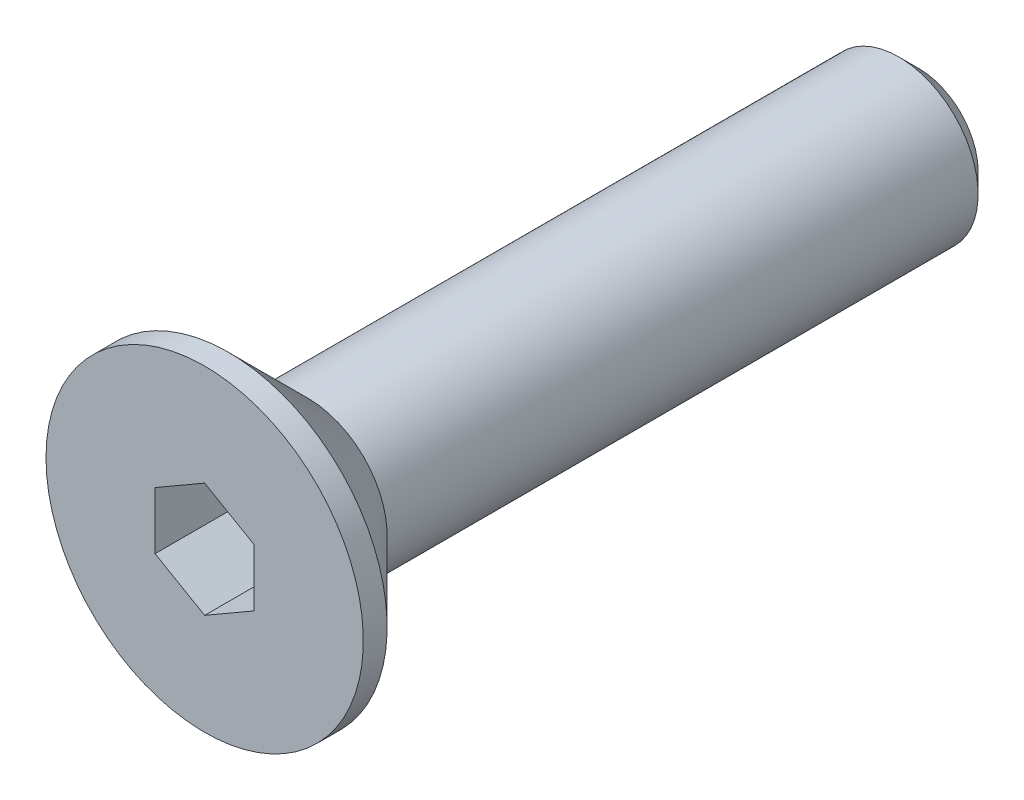
ISO-10303-21;
HEADER;
FILE_DESCRIPTION(('STEP AP214'),'2;1');
FILE_NAME('part.step','',(''),(''),'','','');
FILE_SCHEMA(('AUTOMOTIVE_DESIGN { 1 0 10303 214 1 1 1 1 }'));
ENDSEC;
DATA;
#1=APPLICATION_CONTEXT('core data for automotive mechanical design processes');
#2=APPLICATION_PROTOCOL_DEFINITION('international standard','automotive_design',2000,#1);
#3=PRODUCT_CONTEXT('',#1,'mechanical');
#4=PRODUCT('Part','Part','',(#3));
#5=PRODUCT_RELATED_PRODUCT_CATEGORY('part','',(#4));
#6=PRODUCT_DEFINITION_FORMATION('','',#4);
#7=PRODUCT_DEFINITION_CONTEXT('part definition',#1,'design');
#8=PRODUCT_DEFINITION('design','',#6,#7);
#9=PRODUCT_DEFINITION_SHAPE('','',#8);
#10=(LENGTH_UNIT() NAMED_UNIT(*) SI_UNIT(.MILLI.,.METRE.));
#11=(NAMED_UNIT(*) PLANE_ANGLE_UNIT() SI_UNIT($,.RADIAN.));
#12=(NAMED_UNIT(*) SI_UNIT($,.STERADIAN.) SOLID_ANGLE_UNIT());
#13=UNCERTAINTY_MEASURE_WITH_UNIT(LENGTH_MEASURE(1.E-05),#10,'distance_accuracy_value','');
#14=(GEOMETRIC_REPRESENTATION_CONTEXT(3) GLOBAL_UNCERTAINTY_ASSIGNED_CONTEXT((#13)) GLOBAL_UNIT_ASSIGNED_CONTEXT((#10,
#11,#12)) REPRESENTATION_CONTEXT('',''));
#15=CARTESIAN_POINT('',(0.,0.,0.));
#16=DIRECTION('',(0.,0.,1.));
#17=DIRECTION('',(1.,0.,0.));
#18=AXIS2_PLACEMENT_3D('',#15,#16,#17);
#19=CARTESIAN_POINT('',(0.,0.,9.));
#20=DIRECTION('',(0.,0.,1.));
#21=DIRECTION('',(1.,0.,0.));
#22=AXIS2_PLACEMENT_3D('',#19,#20,#21);
#23=PLANE('',#22);
#24=DIRECTION('',(-0.866025403784439,0.5,0.));
#25=VECTOR('',#24,1.);
#26=CARTESIAN_POINT('',(1.25,0.721687836487034,9.));
#27=LINE('',#26,#25);
#28=CARTESIAN_POINT('',(1.25,0.721687836487034,9.));
#29=VERTEX_POINT('',#28);
#30=CARTESIAN_POINT('',(0.,1.44337567297407,9.));
#31=VERTEX_POINT('',#30);
#32=EDGE_CURVE('E53',#29,#31,#27,.T.);
#33=ORIENTED_EDGE('',*,*,#32,.F.);
#34=DIRECTION('',(0.,1.,0.));
#35=VECTOR('',#34,1.);
#36=CARTESIAN_POINT('',(1.25,-0.721687836487031,9.));
#37=LINE('',#36,#35);
#38=CARTESIAN_POINT('',(1.25,-0.721687836487031,9.));
#39=VERTEX_POINT('',#38);
#40=EDGE_CURVE('E136',#39,#29,#37,.T.);
#41=ORIENTED_EDGE('',*,*,#40,.F.);
#42=DIRECTION('',(0.866025403784439,0.5,0.));
#43=VECTOR('',#42,1.);
#44=CARTESIAN_POINT('',(0.,-1.44337567297406,9.));
#45=LINE('',#44,#43);
#46=CARTESIAN_POINT('',(0.,-1.44337567297406,9.));
#47=VERTEX_POINT('',#46);
#48=EDGE_CURVE('E134',#47,#39,#45,.T.);
#49=ORIENTED_EDGE('',*,*,#48,.F.);
#50=DIRECTION('',(0.866025403784439,-0.5,0.));
#51=VECTOR('',#50,1.);
#52=CARTESIAN_POINT('',(-1.25,-0.721687836487031,9.));
#53=LINE('',#52,#51);
#54=CARTESIAN_POINT('',(-1.25,-0.721687836487031,9.));
#55=VERTEX_POINT('',#54);
#56=EDGE_CURVE('E101',#55,#47,#53,.T.);
#57=ORIENTED_EDGE('',*,*,#56,.F.);
#58=DIRECTION('',(0.,-1.,0.));
#59=VECTOR('',#58,1.);
#60=CARTESIAN_POINT('',(-1.25,0.721687836487034,9.));
#61=LINE('',#60,#59);
#62=CARTESIAN_POINT('',(-1.25,0.721687836487034,9.));
#63=VERTEX_POINT('',#62);
#64=EDGE_CURVE('E130',#63,#55,#61,.T.);
#65=ORIENTED_EDGE('',*,*,#64,.F.);
#66=DIRECTION('',(-0.866025403784439,-0.5,0.));
#67=VECTOR('',#66,1.);
#68=CARTESIAN_POINT('',(0.,1.44337567297407,9.));
#69=LINE('',#68,#67);
#70=EDGE_CURVE('E127',#31,#63,#69,.T.);
#71=ORIENTED_EDGE('',*,*,#70,.F.);
#72=EDGE_LOOP('',(#33,#41,#49,#57,#65,#71));
#73=FACE_BOUND('',#72,.T.);
#74=CARTESIAN_POINT('',(0.,0.,9.));
#75=DIRECTION('',(0.,0.,-1.));
#76=DIRECTION('',(-1.,0.,0.));
#77=AXIS2_PLACEMENT_3D('',#74,#75,#76);
#78=CIRCLE('',#77,4.);
#79=CARTESIAN_POINT('',(-4.,0.,9.));
#80=VERTEX_POINT('',#79);
#81=EDGE_CURVE('E151',#80,#80,#78,.T.);
#82=ORIENTED_EDGE('',*,*,#81,.F.);
#83=EDGE_LOOP('',(#82));
#84=FACE_BOUND('',#83,.T.);
#85=ADVANCED_FACE('F37',(#73,#84),#23,.T.);
#86=CARTESIAN_POINT('',(0.,0.,-9.));
#87=DIRECTION('',(0.,0.,-1.));
#88=DIRECTION('',(-1.,0.,0.));
#89=AXIS2_PLACEMENT_3D('',#86,#87,#88);
#90=CYLINDRICAL_SURFACE('',#89,4.);
#91=ORIENTED_EDGE('',*,*,#81,.T.);
#92=EDGE_LOOP('',(#91));
#93=FACE_BOUND('',#92,.T.);
#94=CARTESIAN_POINT('',(0.,0.,8.39999999999999));
#95=DIRECTION('',(0.,0.,-1.));
#96=DIRECTION('',(-1.,0.,0.));
#97=AXIS2_PLACEMENT_3D('',#94,#95,#96);
#98=CIRCLE('',#97,4.);
#99=CARTESIAN_POINT('',(-4.,0.,8.39999999999999));
#100=VERTEX_POINT('',#99);
#101=EDGE_CURVE('E148',#100,#100,#98,.T.);
#102=ORIENTED_EDGE('',*,*,#101,.F.);
#103=EDGE_LOOP('',(#102));
#104=FACE_BOUND('',#103,.T.);
#105=ADVANCED_FACE('F171',(#93,#104),#90,.T.);
#106=CARTESIAN_POINT('',(0.,0.,6.4));
#107=DIRECTION('',(0.,0.,1.));
#108=DIRECTION('',(1.,0.,0.));
#109=AXIS2_PLACEMENT_3D('',#106,#107,#108);
#110=CONICAL_SURFACE('',#109,2.,0.78539816339745);
#111=ORIENTED_EDGE('',*,*,#101,.T.);
#112=EDGE_LOOP('',(#111));
#113=FACE_BOUND('',#112,.T.);
#114=CARTESIAN_POINT('',(0.,0.,6.4));
#115=DIRECTION('',(0.,0.,-1.));
#116=DIRECTION('',(-1.,0.,0.));
#117=AXIS2_PLACEMENT_3D('',#114,#115,#116);
#118=CIRCLE('',#117,2.);
#119=CARTESIAN_POINT('',(-2.,0.,6.4));
#120=VERTEX_POINT('',#119);
#121=EDGE_CURVE('E140',#120,#120,#118,.T.);
#122=ORIENTED_EDGE('',*,*,#121,.F.);
#123=EDGE_LOOP('',(#122));
#124=FACE_BOUND('',#123,.T.);
#125=ADVANCED_FACE('F176',(#113,#124),#110,.T.);
#126=CARTESIAN_POINT('',(0.,0.,-9.));
#127=DIRECTION('',(0.,0.,-1.));
#128=DIRECTION('',(-1.,0.,0.));
#129=AXIS2_PLACEMENT_3D('',#126,#127,#128);
#130=CYLINDRICAL_SURFACE('',#129,2.);
#131=CARTESIAN_POINT('',(0.,0.,-8.49999999999999));
#132=DIRECTION('',(0.,0.,-1.));
#133=DIRECTION('',(-1.,0.,0.));
#134=AXIS2_PLACEMENT_3D('',#131,#132,#133);
#135=CIRCLE('',#134,2.);
#136=CARTESIAN_POINT('',(-2.,0.,-8.49999999999999));
#137=VERTEX_POINT('',#136);
#138=EDGE_CURVE('E11',#137,#137,#135,.F.);
#139=ORIENTED_EDGE('',*,*,#138,.T.);
#140=EDGE_LOOP('',(#139));
#141=FACE_BOUND('',#140,.T.);
#142=ORIENTED_EDGE('',*,*,#121,.T.);
#143=EDGE_LOOP('',(#142));
#144=FACE_BOUND('',#143,.T.);
#145=ADVANCED_FACE('F167',(#141,#144),#130,.T.);
#146=CARTESIAN_POINT('',(0.,2.,-9.));
#147=DIRECTION('',(0.,0.,-1.));
#148=DIRECTION('',(-1.,0.,0.));
#149=AXIS2_PLACEMENT_3D('',#146,#147,#148);
#150=PLANE('',#149);
#151=CARTESIAN_POINT('',(0.,0.,-9.));
#152=DIRECTION('',(0.,0.,-1.));
#153=DIRECTION('',(-1.,0.,0.));
#154=AXIS2_PLACEMENT_3D('',#151,#152,#153);
#155=CIRCLE('',#154,1.5);
#156=CARTESIAN_POINT('',(-1.5,0.,-9.));
#157=VERTEX_POINT('',#156);
#158=EDGE_CURVE('E46',#157,#157,#155,.T.);
#159=ORIENTED_EDGE('',*,*,#158,.T.);
#160=EDGE_LOOP('',(#159));
#161=FACE_BOUND('',#160,.T.);
#162=ADVANCED_FACE('F156',(#161),#150,.T.);
#163=CARTESIAN_POINT('',(0.,0.,-9.));
#164=DIRECTION('',(0.,0.,1.));
#165=DIRECTION('',(1.,0.,0.));
#166=AXIS2_PLACEMENT_3D('',#163,#164,#165);
#167=CONICAL_SURFACE('',#166,1.5,0.785398163397447);
#168=ORIENTED_EDGE('',*,*,#138,.F.);
#169=EDGE_LOOP('',(#168));
#170=FACE_BOUND('',#169,.T.);
#171=ORIENTED_EDGE('',*,*,#158,.F.);
#172=EDGE_LOOP('',(#171));
#173=FACE_BOUND('',#172,.T.);
#174=ADVANCED_FACE('F40',(#170,#173),#167,.T.);
#175=CARTESIAN_POINT('',(1.25,0.721687836487034,6.5));
#176=DIRECTION('',(0.5,0.866025403784439,0.));
#177=DIRECTION('',(-0.866025403784439,0.5,0.));
#178=AXIS2_PLACEMENT_3D('',#175,#176,#177);
#179=PLANE('',#178);
#180=ORIENTED_EDGE('',*,*,#32,.T.);
#181=DIRECTION('',(0.,0.,1.));
#182=VECTOR('',#181,1.);
#183=CARTESIAN_POINT('',(0.,1.44337567297407,6.5));
#184=LINE('',#183,#182);
#185=CARTESIAN_POINT('',(0.,1.44337567297407,6.5));
#186=VERTEX_POINT('',#185);
#187=EDGE_CURVE('E83',#186,#31,#184,.T.);
#188=ORIENTED_EDGE('',*,*,#187,.F.);
#189=DIRECTION('',(-0.866025403784439,0.5,0.));
#190=VECTOR('',#189,1.);
#191=CARTESIAN_POINT('',(1.25,0.721687836487034,6.5));
#192=LINE('',#191,#190);
#193=CARTESIAN_POINT('',(1.25,0.721687836487034,6.5));
#194=VERTEX_POINT('',#193);
#195=EDGE_CURVE('E138',#194,#186,#192,.T.);
#196=ORIENTED_EDGE('',*,*,#195,.F.);
#197=DIRECTION('',(0.,0.,1.));
#198=VECTOR('',#197,1.);
#199=CARTESIAN_POINT('',(1.25,0.721687836487034,6.5));
#200=LINE('',#199,#198);
#201=EDGE_CURVE('E61',#194,#29,#200,.T.);
#202=ORIENTED_EDGE('',*,*,#201,.T.);
#203=EDGE_LOOP('',(#180,#188,#196,#202));
#204=FACE_BOUND('',#203,.T.);
#205=ADVANCED_FACE('F159',(#204),#179,.F.);
#206=CARTESIAN_POINT('',(1.25,-0.721687836487031,6.5));
#207=DIRECTION('',(1.,0.,0.));
#208=DIRECTION('',(0.,1.,0.));
#209=AXIS2_PLACEMENT_3D('',#206,#207,#208);
#210=PLANE('',#209);
#211=ORIENTED_EDGE('',*,*,#40,.T.);
#212=ORIENTED_EDGE('',*,*,#201,.F.);
#213=DIRECTION('',(0.,1.,0.));
#214=VECTOR('',#213,1.);
#215=CARTESIAN_POINT('',(1.25,-0.721687836487031,6.5));
#216=LINE('',#215,#214);
#217=CARTESIAN_POINT('',(1.25,-0.721687836487031,6.5));
#218=VERTEX_POINT('',#217);
#219=EDGE_CURVE('E113',#218,#194,#216,.T.);
#220=ORIENTED_EDGE('',*,*,#219,.F.);
#221=DIRECTION('',(0.,0.,1.));
#222=VECTOR('',#221,1.);
#223=CARTESIAN_POINT('',(1.25,-0.721687836487031,6.5));
#224=LINE('',#223,#222);
#225=EDGE_CURVE('E105',#218,#39,#224,.T.);
#226=ORIENTED_EDGE('',*,*,#225,.T.);
#227=EDGE_LOOP('',(#211,#212,#220,#226));
#228=FACE_BOUND('',#227,.T.);
#229=ADVANCED_FACE('F165',(#228),#210,.F.);
#230=CARTESIAN_POINT('',(0.,-1.44337567297406,6.5));
#231=DIRECTION('',(0.5,-0.866025403784439,0.));
#232=DIRECTION('',(0.866025403784439,0.5,0.));
#233=AXIS2_PLACEMENT_3D('',#230,#231,#232);
#234=PLANE('',#233);
#235=ORIENTED_EDGE('',*,*,#48,.T.);
#236=ORIENTED_EDGE('',*,*,#225,.F.);
#237=DIRECTION('',(0.866025403784439,0.5,0.));
#238=VECTOR('',#237,1.);
#239=CARTESIAN_POINT('',(0.,-1.44337567297406,6.5));
#240=LINE('',#239,#238);
#241=CARTESIAN_POINT('',(0.,-1.44337567297406,6.5));
#242=VERTEX_POINT('',#241);
#243=EDGE_CURVE('E109',#242,#218,#240,.T.);
#244=ORIENTED_EDGE('',*,*,#243,.F.);
#245=DIRECTION('',(0.,0.,1.));
#246=VECTOR('',#245,1.);
#247=CARTESIAN_POINT('',(0.,-1.44337567297406,6.5));
#248=LINE('',#247,#246);
#249=EDGE_CURVE('E94',#242,#47,#248,.T.);
#250=ORIENTED_EDGE('',*,*,#249,.T.);
#251=EDGE_LOOP('',(#235,#236,#244,#250));
#252=FACE_BOUND('',#251,.T.);
#253=ADVANCED_FACE('F110',(#252),#234,.F.);
#254=CARTESIAN_POINT('',(-1.25,-0.721687836487031,6.5));
#255=DIRECTION('',(-0.5,-0.866025403784438,0.));
#256=DIRECTION('',(0.866025403784439,-0.5,0.));
#257=AXIS2_PLACEMENT_3D('',#254,#255,#256);
#258=PLANE('',#257);
#259=ORIENTED_EDGE('',*,*,#56,.T.);
#260=ORIENTED_EDGE('',*,*,#249,.F.);
#261=DIRECTION('',(0.866025403784439,-0.5,0.));
#262=VECTOR('',#261,1.);
#263=CARTESIAN_POINT('',(-1.25,-0.721687836487031,6.5));
#264=LINE('',#263,#262);
#265=CARTESIAN_POINT('',(-1.25,-0.721687836487031,6.5));
#266=VERTEX_POINT('',#265);
#267=EDGE_CURVE('E98',#266,#242,#264,.T.);
#268=ORIENTED_EDGE('',*,*,#267,.F.);
#269=DIRECTION('',(0.,0.,1.));
#270=VECTOR('',#269,1.);
#271=CARTESIAN_POINT('',(-1.25,-0.721687836487031,6.5));
#272=LINE('',#271,#270);
#273=EDGE_CURVE('E106',#266,#55,#272,.T.);
#274=ORIENTED_EDGE('',*,*,#273,.T.);
#275=EDGE_LOOP('',(#259,#260,#268,#274));
#276=FACE_BOUND('',#275,.T.);
#277=ADVANCED_FACE('F96',(#276),#258,.F.);
#278=CARTESIAN_POINT('',(-1.25,0.721687836487034,6.5));
#279=DIRECTION('',(-1.,0.,0.));
#280=DIRECTION('',(0.,0.,1.));
#281=AXIS2_PLACEMENT_3D('',#278,#279,#280);
#282=PLANE('',#281);
#283=ORIENTED_EDGE('',*,*,#64,.T.);
#284=ORIENTED_EDGE('',*,*,#273,.F.);
#285=DIRECTION('',(0.,-1.,0.));
#286=VECTOR('',#285,1.);
#287=CARTESIAN_POINT('',(-1.25,0.721687836487034,6.5));
#288=LINE('',#287,#286);
#289=CARTESIAN_POINT('',(-1.25,0.721687836487034,6.5));
#290=VERTEX_POINT('',#289);
#291=EDGE_CURVE('E119',#290,#266,#288,.T.);
#292=ORIENTED_EDGE('',*,*,#291,.F.);
#293=DIRECTION('',(0.,0.,1.));
#294=VECTOR('',#293,1.);
#295=CARTESIAN_POINT('',(-1.25,0.721687836487034,6.5));
#296=LINE('',#295,#294);
#297=EDGE_CURVE('E143',#290,#63,#296,.T.);
#298=ORIENTED_EDGE('',*,*,#297,.T.);
#299=EDGE_LOOP('',(#283,#284,#292,#298));
#300=FACE_BOUND('',#299,.T.);
#301=ADVANCED_FACE('F190',(#300),#282,.F.);
#302=CARTESIAN_POINT('',(0.,1.44337567297407,6.5));
#303=DIRECTION('',(-0.5,0.866025403784439,0.));
#304=DIRECTION('',(-0.866025403784439,-0.5,0.));
#305=AXIS2_PLACEMENT_3D('',#302,#303,#304);
#306=PLANE('',#305);
#307=ORIENTED_EDGE('',*,*,#70,.T.);
#308=ORIENTED_EDGE('',*,*,#297,.F.);
#309=DIRECTION('',(-0.866025403784439,-0.5,0.));
#310=VECTOR('',#309,1.);
#311=CARTESIAN_POINT('',(0.,1.44337567297407,6.5));
#312=LINE('',#311,#310);
#313=EDGE_CURVE('E121',#186,#290,#312,.T.);
#314=ORIENTED_EDGE('',*,*,#313,.F.);
#315=ORIENTED_EDGE('',*,*,#187,.T.);
#316=EDGE_LOOP('',(#307,#308,#314,#315));
#317=FACE_BOUND('',#316,.T.);
#318=ADVANCED_FACE('F187',(#317),#306,.F.);
#319=CARTESIAN_POINT('',(0.,0.,6.5));
#320=DIRECTION('',(0.,0.,1.));
#321=DIRECTION('',(1.,0.,0.));
#322=AXIS2_PLACEMENT_3D('',#319,#320,#321);
#323=PLANE('',#322);
#324=ORIENTED_EDGE('',*,*,#195,.T.);
#325=ORIENTED_EDGE('',*,*,#313,.T.);
#326=ORIENTED_EDGE('',*,*,#291,.T.);
#327=ORIENTED_EDGE('',*,*,#267,.T.);
#328=ORIENTED_EDGE('',*,*,#243,.T.);
#329=ORIENTED_EDGE('',*,*,#219,.T.);
#330=EDGE_LOOP('',(#324,#325,#326,#327,#328,#329));
#331=FACE_BOUND('',#330,.T.);
#332=ADVANCED_FACE('F116',(#331),#323,.T.);
#333=CLOSED_SHELL('',(#85,#105,#125,#145,#162,#174,#205,#229,#253,#277,#301,#318,#332));
#334=MANIFOLD_SOLID_BREP('B2',#333);
#335=ADVANCED_BREP_SHAPE_REPRESENTATION('',(#18,#334),#14);
#336=SHAPE_DEFINITION_REPRESENTATION(#9,#335);
ENDSEC;
END-ISO-10303-21;
